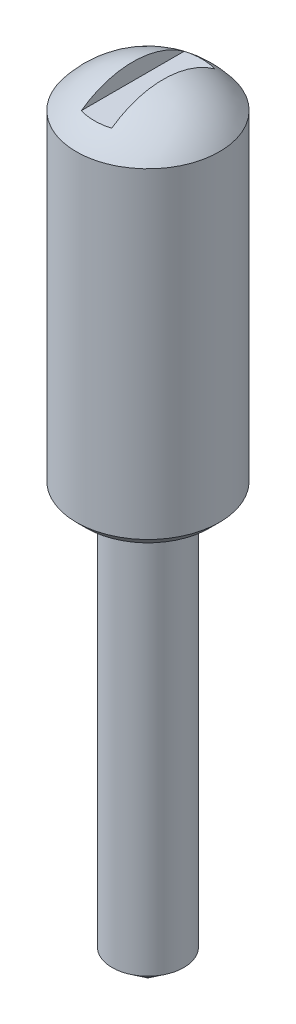
ISO-10303-21;
HEADER;
FILE_DESCRIPTION(('STEP AP214'),'2;1');
FILE_NAME('part.step','',(''),(''),'','','');
FILE_SCHEMA(('AUTOMOTIVE_DESIGN { 1 0 10303 214 1 1 1 1 }'));
ENDSEC;
DATA;
#1=APPLICATION_CONTEXT('core data for automotive mechanical design processes');
#2=APPLICATION_PROTOCOL_DEFINITION('international standard','automotive_design',2000,#1);
#3=PRODUCT_CONTEXT('',#1,'mechanical');
#4=PRODUCT('Part','Part','',(#3));
#5=PRODUCT_RELATED_PRODUCT_CATEGORY('part','',(#4));
#6=PRODUCT_DEFINITION_FORMATION('','',#4);
#7=PRODUCT_DEFINITION_CONTEXT('part definition',#1,'design');
#8=PRODUCT_DEFINITION('design','',#6,#7);
#9=PRODUCT_DEFINITION_SHAPE('','',#8);
#10=(LENGTH_UNIT() NAMED_UNIT(*) SI_UNIT(.MILLI.,.METRE.));
#11=(NAMED_UNIT(*) PLANE_ANGLE_UNIT() SI_UNIT($,.RADIAN.));
#12=(NAMED_UNIT(*) SI_UNIT($,.STERADIAN.) SOLID_ANGLE_UNIT());
#13=UNCERTAINTY_MEASURE_WITH_UNIT(LENGTH_MEASURE(1.E-05),#10,'distance_accuracy_value','');
#14=(GEOMETRIC_REPRESENTATION_CONTEXT(3) GLOBAL_UNCERTAINTY_ASSIGNED_CONTEXT((#13)) GLOBAL_UNIT_ASSIGNED_CONTEXT((#10,
#11,#12)) REPRESENTATION_CONTEXT('',''));
#15=CARTESIAN_POINT('',(0.,0.,0.));
#16=DIRECTION('',(0.,0.,1.));
#17=DIRECTION('',(1.,0.,0.));
#18=AXIS2_PLACEMENT_3D('',#15,#16,#17);
#19=CARTESIAN_POINT('',(0.,0.,0.));
#20=DIRECTION('',(0.,1.,0.));
#21=DIRECTION('',(0.,0.,1.));
#22=AXIS2_PLACEMENT_3D('',#19,#20,#21);
#23=CONICAL_SURFACE('',#22,0.,0.927295218001613);
#24=CARTESIAN_POINT('',(0.,1.5,0.));
#25=DIRECTION('',(0.,1.,0.));
#26=DIRECTION('',(0.,0.,1.));
#27=AXIS2_PLACEMENT_3D('',#24,#25,#26);
#28=CIRCLE('',#27,2.00000000000001);
#29=CARTESIAN_POINT('',(0.,1.5,2.00000000000001));
#30=VERTEX_POINT('',#29);
#31=EDGE_CURVE('E81',#30,#30,#28,.T.);
#32=ORIENTED_EDGE('',*,*,#31,.F.);
#33=EDGE_LOOP('',(#32));
#34=FACE_BOUND('',#33,.T.);
#35=CARTESIAN_POINT('',(0.,0.,0.));
#36=VERTEX_POINT('',#35);
#37=VERTEX_LOOP('',#36);
#38=FACE_BOUND('',#37,.T.);
#39=ADVANCED_FACE('F48',(#34,#38),#23,.T.);
#40=CARTESIAN_POINT('',(0.,42.,0.));
#41=DIRECTION('',(0.,1.,0.));
#42=DIRECTION('',(0.,0.,1.));
#43=AXIS2_PLACEMENT_3D('',#40,#41,#42);
#44=CYLINDRICAL_SURFACE('',#43,2.00000000000001);
#45=CARTESIAN_POINT('',(0.,23.5,0.));
#46=DIRECTION('',(0.,1.,0.));
#47=DIRECTION('',(0.,0.,1.));
#48=AXIS2_PLACEMENT_3D('',#45,#46,#47);
#49=CIRCLE('',#48,2.00000000000001);
#50=CARTESIAN_POINT('',(0.,23.5,2.00000000000001));
#51=VERTEX_POINT('',#50);
#52=EDGE_CURVE('E188',#51,#51,#49,.T.);
#53=ORIENTED_EDGE('',*,*,#52,.F.);
#54=EDGE_LOOP('',(#53));
#55=FACE_BOUND('',#54,.T.);
#56=ORIENTED_EDGE('',*,*,#31,.T.);
#57=EDGE_LOOP('',(#56));
#58=FACE_BOUND('',#57,.T.);
#59=ADVANCED_FACE('F111',(#55,#58),#44,.T.);
#60=CARTESIAN_POINT('',(2.00000000000001,23.5,0.));
#61=DIRECTION('',(0.,1.,0.));
#62=DIRECTION('',(0.,0.,1.));
#63=AXIS2_PLACEMENT_3D('',#60,#61,#62);
#64=PLANE('',#63);
#65=CARTESIAN_POINT('',(0.,23.5,0.));
#66=DIRECTION('',(0.,1.,0.));
#67=DIRECTION('',(0.,0.,1.));
#68=AXIS2_PLACEMENT_3D('',#65,#66,#67);
#69=CIRCLE('',#68,3.44549999999999);
#70=CARTESIAN_POINT('',(0.,23.5,3.44549999999999));
#71=VERTEX_POINT('',#70);
#72=EDGE_CURVE('E13',#71,#71,#69,.F.);
#73=ORIENTED_EDGE('',*,*,#72,.T.);
#74=EDGE_LOOP('',(#73));
#75=FACE_BOUND('',#74,.T.);
#76=ORIENTED_EDGE('',*,*,#52,.T.);
#77=EDGE_LOOP('',(#76));
#78=FACE_BOUND('',#77,.T.);
#79=ADVANCED_FACE('F117',(#75,#78),#64,.F.);
#80=CARTESIAN_POINT('',(0.,42.,0.));
#81=DIRECTION('',(0.,1.,0.));
#82=DIRECTION('',(0.,0.,1.));
#83=AXIS2_PLACEMENT_3D('',#80,#81,#82);
#84=CYLINDRICAL_SURFACE('',#83,4.);
#85=CARTESIAN_POINT('',(0.,24.0545,0.));
#86=DIRECTION('',(0.,1.,0.));
#87=DIRECTION('',(0.,0.,1.));
#88=AXIS2_PLACEMENT_3D('',#85,#86,#87);
#89=CIRCLE('',#88,4.);
#90=CARTESIAN_POINT('',(0.,24.0545,4.));
#91=VERTEX_POINT('',#90);
#92=EDGE_CURVE('E56',#91,#91,#89,.T.);
#93=ORIENTED_EDGE('',*,*,#92,.T.);
#94=EDGE_LOOP('',(#93));
#95=FACE_BOUND('',#94,.T.);
#96=CARTESIAN_POINT('',(0.,42.,0.));
#97=DIRECTION('',(0.,1.,0.));
#98=DIRECTION('',(0.,0.,1.));
#99=AXIS2_PLACEMENT_3D('',#96,#97,#98);
#100=CIRCLE('',#99,4.);
#101=CARTESIAN_POINT('',(0.,42.,4.));
#102=VERTEX_POINT('',#101);
#103=EDGE_CURVE('E189',#102,#102,#100,.T.);
#104=ORIENTED_EDGE('',*,*,#103,.F.);
#105=EDGE_LOOP('',(#104));
#106=FACE_BOUND('',#105,.T.);
#107=ADVANCED_FACE('F100',(#95,#106),#84,.T.);
#108=CARTESIAN_POINT('',(0.,39.,0.));
#109=DIRECTION('',(0.,0.,1.));
#110=DIRECTION('',(1.,0.,0.));
#111=AXIS2_PLACEMENT_3D('',#108,#109,#110);
#112=SPHERICAL_SURFACE('',#111,5.);
#113=CARTESIAN_POINT('',(0.,43.,0.));
#114=DIRECTION('',(0.,-1.,0.));
#115=DIRECTION('',(0.,0.,-1.));
#116=AXIS2_PLACEMENT_3D('',#113,#114,#115);
#117=CIRCLE('',#116,3.);
#118=CARTESIAN_POINT('',(-0.850000000000008,43.,-2.87706447616316));
#119=VERTEX_POINT('',#118);
#120=CARTESIAN_POINT('',(0.849999999999992,43.,-2.87706447616316));
#121=VERTEX_POINT('',#120);
#122=EDGE_CURVE('E80',#119,#121,#117,.T.);
#123=ORIENTED_EDGE('',*,*,#122,.T.);
#124=CARTESIAN_POINT('',(0.849999999999993,39.,0.));
#125=DIRECTION('',(1.,0.,0.));
#126=DIRECTION('',(0.,1.,0.));
#127=AXIS2_PLACEMENT_3D('',#124,#125,#126);
#128=CIRCLE('',#127,4.92722031169706);
#129=CARTESIAN_POINT('',(0.849999999999992,43.,2.87706447616316));
#130=VERTEX_POINT('',#129);
#131=EDGE_CURVE('E93',#121,#130,#128,.T.);
#132=ORIENTED_EDGE('',*,*,#131,.T.);
#133=CARTESIAN_POINT('',(-0.850000000000008,43.,2.87706447616316));
#134=VERTEX_POINT('',#133);
#135=EDGE_CURVE('E86',#130,#134,#117,.T.);
#136=ORIENTED_EDGE('',*,*,#135,.T.);
#137=CARTESIAN_POINT('',(-0.850000000000007,39.,0.));
#138=DIRECTION('',(-1.,0.,0.));
#139=DIRECTION('',(0.,-1.,0.));
#140=AXIS2_PLACEMENT_3D('',#137,#138,#139);
#141=CIRCLE('',#140,4.92722031169705);
#142=EDGE_CURVE('E75',#134,#119,#141,.T.);
#143=ORIENTED_EDGE('',*,*,#142,.T.);
#144=EDGE_LOOP('',(#123,#132,#136,#143));
#145=FACE_BOUND('',#144,.T.);
#146=ORIENTED_EDGE('',*,*,#103,.T.);
#147=EDGE_LOOP('',(#146));
#148=FACE_BOUND('',#147,.T.);
#149=ADVANCED_FACE('F91',(#145,#148),#112,.T.);
#150=CARTESIAN_POINT('',(0.849999999999991,53.,-4.));
#151=DIRECTION('',(1.,0.,0.));
#152=DIRECTION('',(0.,1.,0.));
#153=AXIS2_PLACEMENT_3D('',#150,#151,#152);
#154=PLANE('',#153);
#155=DIRECTION('',(0.,0.,1.));
#156=VECTOR('',#155,1.);
#157=CARTESIAN_POINT('',(0.849999999999992,43.,-4.));
#158=LINE('',#157,#156);
#159=EDGE_CURVE('E88',#121,#130,#158,.T.);
#160=ORIENTED_EDGE('',*,*,#159,.T.);
#161=ORIENTED_EDGE('',*,*,#131,.F.);
#162=EDGE_LOOP('',(#160,#161));
#163=FACE_BOUND('',#162,.T.);
#164=ADVANCED_FACE('F123',(#163),#154,.F.);
#165=CARTESIAN_POINT('',(-0.850000000000008,43.,-4.));
#166=DIRECTION('',(0.,-1.,0.));
#167=DIRECTION('',(0.,0.,-1.));
#168=AXIS2_PLACEMENT_3D('',#165,#166,#167);
#169=PLANE('',#168);
#170=ORIENTED_EDGE('',*,*,#159,.F.);
#171=ORIENTED_EDGE('',*,*,#122,.F.);
#172=DIRECTION('',(0.,0.,1.));
#173=VECTOR('',#172,1.);
#174=CARTESIAN_POINT('',(-0.850000000000008,43.,-4.));
#175=LINE('',#174,#173);
#176=EDGE_CURVE('E62',#119,#134,#175,.T.);
#177=ORIENTED_EDGE('',*,*,#176,.T.);
#178=ORIENTED_EDGE('',*,*,#135,.F.);
#179=EDGE_LOOP('',(#170,#171,#177,#178));
#180=FACE_BOUND('',#179,.T.);
#181=ADVANCED_FACE('F85',(#180),#169,.F.);
#182=CARTESIAN_POINT('',(-0.850000000000009,53.,-4.));
#183=DIRECTION('',(-1.,0.,0.));
#184=DIRECTION('',(0.,-1.,0.));
#185=AXIS2_PLACEMENT_3D('',#182,#183,#184);
#186=PLANE('',#185);
#187=ORIENTED_EDGE('',*,*,#176,.F.);
#188=ORIENTED_EDGE('',*,*,#142,.F.);
#189=EDGE_LOOP('',(#187,#188));
#190=FACE_BOUND('',#189,.T.);
#191=ADVANCED_FACE('F76',(#190),#186,.F.);
#192=CARTESIAN_POINT('',(0.,24.0545,0.));
#193=DIRECTION('',(0.,1.,0.));
#194=DIRECTION('',(0.,0.,1.));
#195=AXIS2_PLACEMENT_3D('',#192,#193,#194);
#196=CONICAL_SURFACE('',#195,4.,0.785398163397456);
#197=ORIENTED_EDGE('',*,*,#72,.F.);
#198=EDGE_LOOP('',(#197));
#199=FACE_BOUND('',#198,.T.);
#200=ORIENTED_EDGE('',*,*,#92,.F.);
#201=EDGE_LOOP('',(#200));
#202=FACE_BOUND('',#201,.T.);
#203=ADVANCED_FACE('F50',(#199,#202),#196,.T.);
#204=CLOSED_SHELL('',(#39,#59,#79,#107,#149,#164,#181,#191,#203));
#205=MANIFOLD_SOLID_BREP('B2',#204);
#206=ADVANCED_BREP_SHAPE_REPRESENTATION('',(#18,#205),#14);
#207=SHAPE_DEFINITION_REPRESENTATION(#9,#206);
ENDSEC;
END-ISO-10303-21;
